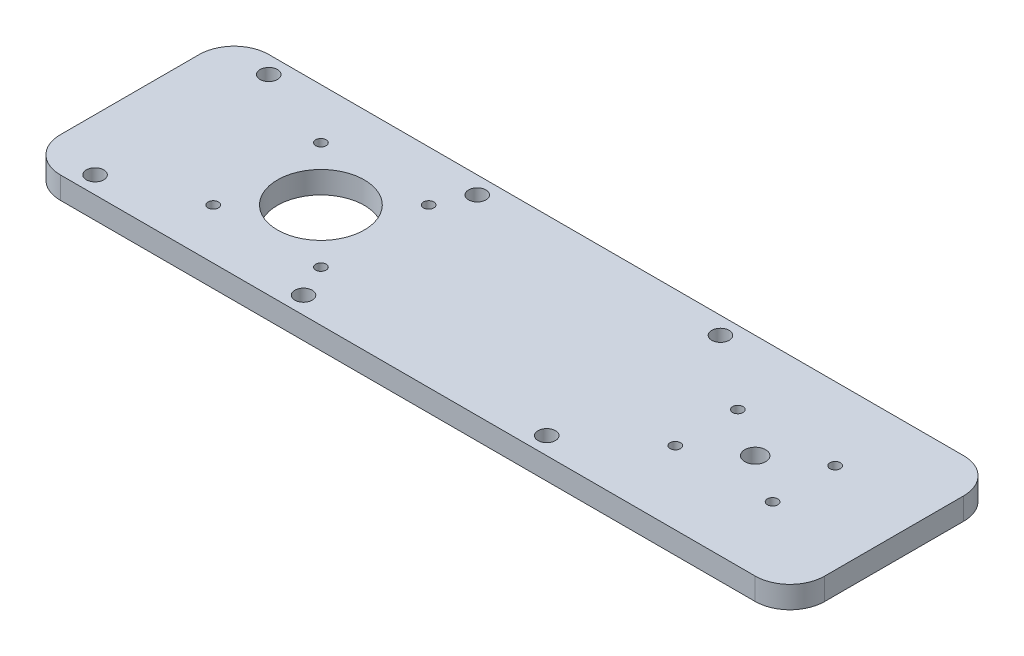
ISO-10303-21;
HEADER;
FILE_DESCRIPTION(('STEP AP214'),'2;1');
FILE_NAME('part.step','',(''),(''),'','','');
FILE_SCHEMA(('AUTOMOTIVE_DESIGN { 1 0 10303 214 1 1 1 1 }'));
ENDSEC;
DATA;
#1=APPLICATION_CONTEXT('core data for automotive mechanical design processes');
#2=APPLICATION_PROTOCOL_DEFINITION('international standard','automotive_design',2000,#1);
#3=PRODUCT_CONTEXT('',#1,'mechanical');
#4=PRODUCT('Part','Part','',(#3));
#5=PRODUCT_RELATED_PRODUCT_CATEGORY('part','',(#4));
#6=PRODUCT_DEFINITION_FORMATION('','',#4);
#7=PRODUCT_DEFINITION_CONTEXT('part definition',#1,'design');
#8=PRODUCT_DEFINITION('design','',#6,#7);
#9=PRODUCT_DEFINITION_SHAPE('','',#8);
#10=(LENGTH_UNIT() NAMED_UNIT(*) SI_UNIT(.MILLI.,.METRE.));
#11=(NAMED_UNIT(*) PLANE_ANGLE_UNIT() SI_UNIT($,.RADIAN.));
#12=(NAMED_UNIT(*) SI_UNIT($,.STERADIAN.) SOLID_ANGLE_UNIT());
#13=UNCERTAINTY_MEASURE_WITH_UNIT(LENGTH_MEASURE(1.E-05),#10,'distance_accuracy_value','');
#14=(GEOMETRIC_REPRESENTATION_CONTEXT(3) GLOBAL_UNCERTAINTY_ASSIGNED_CONTEXT((#13)) GLOBAL_UNIT_ASSIGNED_CONTEXT((#10,
#11,#12)) REPRESENTATION_CONTEXT('',''));
#15=CARTESIAN_POINT('',(0.,0.,0.));
#16=DIRECTION('',(0.,0.,1.));
#17=DIRECTION('',(1.,0.,0.));
#18=AXIS2_PLACEMENT_3D('',#15,#16,#17);
#19=CARTESIAN_POINT('',(0.,0.,0.));
#20=DIRECTION('',(0.,1.,0.));
#21=DIRECTION('',(0.,0.,1.));
#22=AXIS2_PLACEMENT_3D('',#19,#20,#21);
#23=PLANE('',#22);
#24=CARTESIAN_POINT('',(20.,0.,25.));
#25=DIRECTION('',(0.,1.,0.));
#26=DIRECTION('',(0.,0.,1.));
#27=AXIS2_PLACEMENT_3D('',#24,#25,#26);
#28=CIRCLE('',#27,2.5);
#29=CARTESIAN_POINT('',(20.,0.,27.5));
#30=VERTEX_POINT('',#29);
#31=EDGE_CURVE('E330',#30,#30,#28,.T.);
#32=ORIENTED_EDGE('',*,*,#31,.T.);
#33=EDGE_LOOP('',(#32));
#34=FACE_BOUND('',#33,.T.);
#35=CARTESIAN_POINT('',(90.,0.,25.));
#36=DIRECTION('',(0.,1.,0.));
#37=DIRECTION('',(0.,0.,1.));
#38=AXIS2_PLACEMENT_3D('',#35,#36,#37);
#39=CIRCLE('',#38,2.5);
#40=CARTESIAN_POINT('',(90.,0.,27.5));
#41=VERTEX_POINT('',#40);
#42=EDGE_CURVE('E322',#41,#41,#39,.T.);
#43=ORIENTED_EDGE('',*,*,#42,.T.);
#44=EDGE_LOOP('',(#43));
#45=FACE_BOUND('',#44,.T.);
#46=CARTESIAN_POINT('',(90.,0.,-25.));
#47=DIRECTION('',(0.,1.,0.));
#48=DIRECTION('',(0.,0.,1.));
#49=AXIS2_PLACEMENT_3D('',#46,#47,#48);
#50=CIRCLE('',#49,2.5);
#51=CARTESIAN_POINT('',(90.,0.,-22.5));
#52=VERTEX_POINT('',#51);
#53=EDGE_CURVE('E314',#52,#52,#50,.T.);
#54=ORIENTED_EDGE('',*,*,#53,.T.);
#55=EDGE_LOOP('',(#54));
#56=FACE_BOUND('',#55,.T.);
#57=CARTESIAN_POINT('',(20.,0.,-25.));
#58=DIRECTION('',(0.,1.,0.));
#59=DIRECTION('',(0.,0.,1.));
#60=AXIS2_PLACEMENT_3D('',#57,#58,#59);
#61=CIRCLE('',#60,2.5);
#62=CARTESIAN_POINT('',(20.,0.,-22.5));
#63=VERTEX_POINT('',#62);
#64=EDGE_CURVE('E306',#63,#63,#61,.T.);
#65=ORIENTED_EDGE('',*,*,#64,.T.);
#66=EDGE_LOOP('',(#65));
#67=FACE_BOUND('',#66,.T.);
#68=CARTESIAN_POINT('',(-40.,0.,25.));
#69=DIRECTION('',(0.,1.,0.));
#70=DIRECTION('',(0.,0.,1.));
#71=AXIS2_PLACEMENT_3D('',#68,#69,#70);
#72=CIRCLE('',#71,2.5);
#73=CARTESIAN_POINT('',(-40.,0.,27.5));
#74=VERTEX_POINT('',#73);
#75=EDGE_CURVE('E298',#74,#74,#72,.T.);
#76=ORIENTED_EDGE('',*,*,#75,.T.);
#77=EDGE_LOOP('',(#76));
#78=FACE_BOUND('',#77,.T.);
#79=CARTESIAN_POINT('',(-40.,0.,-25.));
#80=DIRECTION('',(0.,1.,0.));
#81=DIRECTION('',(0.,0.,1.));
#82=AXIS2_PLACEMENT_3D('',#79,#80,#81);
#83=CIRCLE('',#82,2.5);
#84=CARTESIAN_POINT('',(-40.,0.,-22.5));
#85=VERTEX_POINT('',#84);
#86=EDGE_CURVE('E290',#85,#85,#83,.T.);
#87=ORIENTED_EDGE('',*,*,#86,.T.);
#88=EDGE_LOOP('',(#87));
#89=FACE_BOUND('',#88,.T.);
#90=CARTESIAN_POINT('',(125.,0.,0.));
#91=DIRECTION('',(0.,1.,0.));
#92=DIRECTION('',(0.,0.,1.));
#93=AXIS2_PLACEMENT_3D('',#90,#91,#92);
#94=CIRCLE('',#93,3.);
#95=CARTESIAN_POINT('',(125.,0.,3.));
#96=VERTEX_POINT('',#95);
#97=EDGE_CURVE('E247',#96,#96,#94,.T.);
#98=ORIENTED_EDGE('',*,*,#97,.T.);
#99=EDGE_LOOP('',(#98));
#100=FACE_BOUND('',#99,.T.);
#101=CARTESIAN_POINT('',(0.,0.,0.));
#102=DIRECTION('',(0.,1.,0.));
#103=DIRECTION('',(0.,0.,1.));
#104=AXIS2_PLACEMENT_3D('',#101,#102,#103);
#105=CIRCLE('',#104,12.5);
#106=CARTESIAN_POINT('',(0.,0.,12.5));
#107=VERTEX_POINT('',#106);
#108=EDGE_CURVE('E242',#107,#107,#105,.T.);
#109=ORIENTED_EDGE('',*,*,#108,.T.);
#110=EDGE_LOOP('',(#109));
#111=FACE_BOUND('',#110,.T.);
#112=CARTESIAN_POINT('',(-15.5,0.,-15.5));
#113=DIRECTION('',(0.,1.,0.));
#114=DIRECTION('',(0.,0.,1.));
#115=AXIS2_PLACEMENT_3D('',#112,#113,#114);
#116=CIRCLE('',#115,1.5);
#117=CARTESIAN_POINT('',(-15.5,0.,-14.));
#118=VERTEX_POINT('',#117);
#119=EDGE_CURVE('E234',#118,#118,#116,.T.);
#120=ORIENTED_EDGE('',*,*,#119,.T.);
#121=EDGE_LOOP('',(#120));
#122=FACE_BOUND('',#121,.T.);
#123=CARTESIAN_POINT('',(15.5,0.,-15.5000000000002));
#124=DIRECTION('',(0.,1.,0.));
#125=DIRECTION('',(0.,0.,1.));
#126=AXIS2_PLACEMENT_3D('',#123,#124,#125);
#127=CIRCLE('',#126,1.5);
#128=CARTESIAN_POINT('',(15.5,0.,-14.0000000000002));
#129=VERTEX_POINT('',#128);
#130=EDGE_CURVE('E226',#129,#129,#127,.T.);
#131=ORIENTED_EDGE('',*,*,#130,.T.);
#132=EDGE_LOOP('',(#131));
#133=FACE_BOUND('',#132,.T.);
#134=CARTESIAN_POINT('',(15.5,0.,15.4999999999998));
#135=DIRECTION('',(0.,1.,0.));
#136=DIRECTION('',(0.,0.,1.));
#137=AXIS2_PLACEMENT_3D('',#134,#135,#136);
#138=CIRCLE('',#137,1.5);
#139=CARTESIAN_POINT('',(15.5,0.,16.9999999999998));
#140=VERTEX_POINT('',#139);
#141=EDGE_CURVE('E218',#140,#140,#138,.T.);
#142=ORIENTED_EDGE('',*,*,#141,.T.);
#143=EDGE_LOOP('',(#142));
#144=FACE_BOUND('',#143,.T.);
#145=CARTESIAN_POINT('',(-15.5,0.,15.5000000000002));
#146=DIRECTION('',(0.,1.,0.));
#147=DIRECTION('',(0.,0.,1.));
#148=AXIS2_PLACEMENT_3D('',#145,#146,#147);
#149=CIRCLE('',#148,1.5);
#150=CARTESIAN_POINT('',(-15.5,0.,17.0000000000002));
#151=VERTEX_POINT('',#150);
#152=EDGE_CURVE('E145',#151,#151,#149,.T.);
#153=ORIENTED_EDGE('',*,*,#152,.T.);
#154=EDGE_LOOP('',(#153));
#155=FACE_BOUND('',#154,.T.);
#156=DIRECTION('',(1.,0.,0.));
#157=VECTOR('',#156,1.);
#158=CARTESIAN_POINT('',(-55.,0.,30.));
#159=LINE('',#158,#157);
#160=CARTESIAN_POINT('',(-45.,0.,30.));
#161=VERTEX_POINT('',#160);
#162=CARTESIAN_POINT('',(155.,0.,30.));
#163=VERTEX_POINT('',#162);
#164=EDGE_CURVE('E125',#161,#163,#159,.T.);
#165=ORIENTED_EDGE('',*,*,#164,.F.);
#166=CARTESIAN_POINT('',(-45.,0.,20.));
#167=DIRECTION('',(0.,1.,0.));
#168=DIRECTION('',(0.,0.,1.));
#169=AXIS2_PLACEMENT_3D('',#166,#167,#168);
#170=CIRCLE('',#169,10.);
#171=CARTESIAN_POINT('',(-55.,0.,20.));
#172=VERTEX_POINT('',#171);
#173=EDGE_CURVE('E107',#161,#172,#170,.F.);
#174=ORIENTED_EDGE('',*,*,#173,.T.);
#175=DIRECTION('',(0.,0.,1.));
#176=VECTOR('',#175,1.);
#177=CARTESIAN_POINT('',(-55.,0.,-30.));
#178=LINE('',#177,#176);
#179=CARTESIAN_POINT('',(-55.,0.,-20.));
#180=VERTEX_POINT('',#179);
#181=EDGE_CURVE('E138',#180,#172,#178,.T.);
#182=ORIENTED_EDGE('',*,*,#181,.F.);
#183=CARTESIAN_POINT('',(-45.,0.,-20.));
#184=DIRECTION('',(0.,1.,0.));
#185=DIRECTION('',(0.,0.,1.));
#186=AXIS2_PLACEMENT_3D('',#183,#184,#185);
#187=CIRCLE('',#186,10.);
#188=CARTESIAN_POINT('',(-45.,0.,-30.));
#189=VERTEX_POINT('',#188);
#190=EDGE_CURVE('E119',#180,#189,#187,.F.);
#191=ORIENTED_EDGE('',*,*,#190,.T.);
#192=DIRECTION('',(-1.,0.,0.));
#193=VECTOR('',#192,1.);
#194=CARTESIAN_POINT('',(-55.,0.,-30.));
#195=LINE('',#194,#193);
#196=CARTESIAN_POINT('',(155.,0.,-30.));
#197=VERTEX_POINT('',#196);
#198=EDGE_CURVE('E143',#197,#189,#195,.T.);
#199=ORIENTED_EDGE('',*,*,#198,.F.);
#200=CARTESIAN_POINT('',(155.,0.,-20.));
#201=DIRECTION('',(0.,1.,0.));
#202=DIRECTION('',(0.,0.,1.));
#203=AXIS2_PLACEMENT_3D('',#200,#201,#202);
#204=CIRCLE('',#203,10.);
#205=CARTESIAN_POINT('',(165.,0.,-20.));
#206=VERTEX_POINT('',#205);
#207=EDGE_CURVE('E130',#197,#206,#204,.F.);
#208=ORIENTED_EDGE('',*,*,#207,.T.);
#209=DIRECTION('',(0.,0.,-1.));
#210=VECTOR('',#209,1.);
#211=CARTESIAN_POINT('',(165.,0.,-30.));
#212=LINE('',#211,#210);
#213=CARTESIAN_POINT('',(165.,0.,20.));
#214=VERTEX_POINT('',#213);
#215=EDGE_CURVE('E137',#214,#206,#212,.T.);
#216=ORIENTED_EDGE('',*,*,#215,.F.);
#217=CARTESIAN_POINT('',(155.,0.,20.));
#218=DIRECTION('',(0.,1.,0.));
#219=DIRECTION('',(0.,0.,1.));
#220=AXIS2_PLACEMENT_3D('',#217,#218,#219);
#221=CIRCLE('',#220,10.);
#222=EDGE_CURVE('E135',#214,#163,#221,.F.);
#223=ORIENTED_EDGE('',*,*,#222,.T.);
#224=EDGE_LOOP('',(#165,#174,#182,#191,#199,#208,#216,#223));
#225=FACE_BOUND('',#224,.T.);
#226=CARTESIAN_POINT('',(139.,0.,9.));
#227=DIRECTION('',(0.,-1.,0.));
#228=DIRECTION('',(0.,0.,-1.));
#229=AXIS2_PLACEMENT_3D('',#226,#227,#228);
#230=CIRCLE('',#229,1.5);
#231=CARTESIAN_POINT('',(139.,0.,7.5));
#232=VERTEX_POINT('',#231);
#233=EDGE_CURVE('E262',#232,#232,#230,.T.);
#234=ORIENTED_EDGE('',*,*,#233,.F.);
#235=EDGE_LOOP('',(#234));
#236=FACE_BOUND('',#235,.T.);
#237=CARTESIAN_POINT('',(111.,0.,9.));
#238=DIRECTION('',(0.,-1.,0.));
#239=DIRECTION('',(0.,0.,-1.));
#240=AXIS2_PLACEMENT_3D('',#237,#238,#239);
#241=CIRCLE('',#240,1.5);
#242=CARTESIAN_POINT('',(111.,0.,7.5));
#243=VERTEX_POINT('',#242);
#244=EDGE_CURVE('E270',#243,#243,#241,.T.);
#245=ORIENTED_EDGE('',*,*,#244,.F.);
#246=EDGE_LOOP('',(#245));
#247=FACE_BOUND('',#246,.T.);
#248=CARTESIAN_POINT('',(111.,0.,-9.));
#249=DIRECTION('',(0.,-1.,0.));
#250=DIRECTION('',(0.,0.,-1.));
#251=AXIS2_PLACEMENT_3D('',#248,#249,#250);
#252=CIRCLE('',#251,1.5);
#253=CARTESIAN_POINT('',(111.,0.,-10.5));
#254=VERTEX_POINT('',#253);
#255=EDGE_CURVE('E278',#254,#254,#252,.T.);
#256=ORIENTED_EDGE('',*,*,#255,.F.);
#257=EDGE_LOOP('',(#256));
#258=FACE_BOUND('',#257,.T.);
#259=CARTESIAN_POINT('',(139.,0.,-9.));
#260=DIRECTION('',(0.,-1.,0.));
#261=DIRECTION('',(0.,0.,-1.));
#262=AXIS2_PLACEMENT_3D('',#259,#260,#261);
#263=CIRCLE('',#262,1.5);
#264=CARTESIAN_POINT('',(139.,0.,-10.5));
#265=VERTEX_POINT('',#264);
#266=EDGE_CURVE('E286',#265,#265,#263,.T.);
#267=ORIENTED_EDGE('',*,*,#266,.F.);
#268=EDGE_LOOP('',(#267));
#269=FACE_BOUND('',#268,.T.);
#270=ADVANCED_FACE('F39',(#34,#45,#56,#67,#78,#89,#100,#111,#122,#133,#144,#155,#225,#236,#247,
#258,#269),#23,.F.);
#271=CARTESIAN_POINT('',(-55.,6.35,-30.));
#272=DIRECTION('',(1.,0.,0.));
#273=DIRECTION('',(0.,0.,-1.));
#274=AXIS2_PLACEMENT_3D('',#271,#272,#273);
#275=PLANE('',#274);
#276=ORIENTED_EDGE('',*,*,#181,.T.);
#277=DIRECTION('',(0.,-1.,0.));
#278=VECTOR('',#277,1.);
#279=CARTESIAN_POINT('',(-55.,6.35,20.));
#280=LINE('',#279,#278);
#281=CARTESIAN_POINT('',(-55.,6.35,20.));
#282=VERTEX_POINT('',#281);
#283=EDGE_CURVE('E112',#172,#282,#280,.F.);
#284=ORIENTED_EDGE('',*,*,#283,.T.);
#285=DIRECTION('',(0.,0.,1.));
#286=VECTOR('',#285,1.);
#287=CARTESIAN_POINT('',(-55.,6.35,-30.));
#288=LINE('',#287,#286);
#289=CARTESIAN_POINT('',(-55.,6.35,-20.));
#290=VERTEX_POINT('',#289);
#291=EDGE_CURVE('E151',#290,#282,#288,.T.);
#292=ORIENTED_EDGE('',*,*,#291,.F.);
#293=DIRECTION('',(0.,-1.,0.));
#294=VECTOR('',#293,1.);
#295=CARTESIAN_POINT('',(-55.,6.35,-20.));
#296=LINE('',#295,#294);
#297=EDGE_CURVE('E118',#290,#180,#296,.T.);
#298=ORIENTED_EDGE('',*,*,#297,.T.);
#299=EDGE_LOOP('',(#276,#284,#292,#298));
#300=FACE_BOUND('',#299,.T.);
#301=ADVANCED_FACE('F204',(#300),#275,.F.);
#302=CARTESIAN_POINT('',(-55.,6.35,30.));
#303=DIRECTION('',(0.,0.,-1.));
#304=DIRECTION('',(-1.,0.,0.));
#305=AXIS2_PLACEMENT_3D('',#302,#303,#304);
#306=PLANE('',#305);
#307=DIRECTION('',(1.,0.,0.));
#308=VECTOR('',#307,1.);
#309=CARTESIAN_POINT('',(-55.,6.35,30.));
#310=LINE('',#309,#308);
#311=CARTESIAN_POINT('',(-45.,6.35,30.));
#312=VERTEX_POINT('',#311);
#313=CARTESIAN_POINT('',(155.,6.35,30.));
#314=VERTEX_POINT('',#313);
#315=EDGE_CURVE('E128',#312,#314,#310,.T.);
#316=ORIENTED_EDGE('',*,*,#315,.F.);
#317=DIRECTION('',(0.,-1.,0.));
#318=VECTOR('',#317,1.);
#319=CARTESIAN_POINT('',(-45.,6.35,30.));
#320=LINE('',#319,#318);
#321=EDGE_CURVE('E111',#312,#161,#320,.T.);
#322=ORIENTED_EDGE('',*,*,#321,.T.);
#323=ORIENTED_EDGE('',*,*,#164,.T.);
#324=DIRECTION('',(0.,-1.,0.));
#325=VECTOR('',#324,1.);
#326=CARTESIAN_POINT('',(155.,6.35,30.));
#327=LINE('',#326,#325);
#328=EDGE_CURVE('E131',#163,#314,#327,.F.);
#329=ORIENTED_EDGE('',*,*,#328,.T.);
#330=EDGE_LOOP('',(#316,#322,#323,#329));
#331=FACE_BOUND('',#330,.T.);
#332=ADVANCED_FACE('F124',(#331),#306,.F.);
#333=CARTESIAN_POINT('',(165.,6.35,-30.));
#334=DIRECTION('',(-1.,0.,0.));
#335=DIRECTION('',(0.,0.,1.));
#336=AXIS2_PLACEMENT_3D('',#333,#334,#335);
#337=PLANE('',#336);
#338=DIRECTION('',(0.,0.,-1.));
#339=VECTOR('',#338,1.);
#340=CARTESIAN_POINT('',(165.,6.35,-30.));
#341=LINE('',#340,#339);
#342=CARTESIAN_POINT('',(165.,6.35,20.));
#343=VERTEX_POINT('',#342);
#344=CARTESIAN_POINT('',(165.,6.35,-20.));
#345=VERTEX_POINT('',#344);
#346=EDGE_CURVE('E187',#343,#345,#341,.T.);
#347=ORIENTED_EDGE('',*,*,#346,.F.);
#348=DIRECTION('',(0.,-1.,0.));
#349=VECTOR('',#348,1.);
#350=CARTESIAN_POINT('',(165.,6.35,20.));
#351=LINE('',#350,#349);
#352=EDGE_CURVE('E11',#343,#214,#351,.T.);
#353=ORIENTED_EDGE('',*,*,#352,.T.);
#354=ORIENTED_EDGE('',*,*,#215,.T.);
#355=DIRECTION('',(0.,-1.,0.));
#356=VECTOR('',#355,1.);
#357=CARTESIAN_POINT('',(165.,6.35,-20.));
#358=LINE('',#357,#356);
#359=EDGE_CURVE('E48',#206,#345,#358,.F.);
#360=ORIENTED_EDGE('',*,*,#359,.T.);
#361=EDGE_LOOP('',(#347,#353,#354,#360));
#362=FACE_BOUND('',#361,.T.);
#363=ADVANCED_FACE('F186',(#362),#337,.F.);
#364=CARTESIAN_POINT('',(-55.,6.35,-30.));
#365=DIRECTION('',(0.,0.,1.));
#366=DIRECTION('',(1.,0.,0.));
#367=AXIS2_PLACEMENT_3D('',#364,#365,#366);
#368=PLANE('',#367);
#369=ORIENTED_EDGE('',*,*,#198,.T.);
#370=DIRECTION('',(0.,-1.,0.));
#371=VECTOR('',#370,1.);
#372=CARTESIAN_POINT('',(-45.,6.35,-30.));
#373=LINE('',#372,#371);
#374=CARTESIAN_POINT('',(-45.,6.35,-30.));
#375=VERTEX_POINT('',#374);
#376=EDGE_CURVE('E55',#189,#375,#373,.F.);
#377=ORIENTED_EDGE('',*,*,#376,.T.);
#378=DIRECTION('',(-1.,0.,0.));
#379=VECTOR('',#378,1.);
#380=CARTESIAN_POINT('',(-55.,6.35,-30.));
#381=LINE('',#380,#379);
#382=CARTESIAN_POINT('',(155.,6.35,-30.));
#383=VERTEX_POINT('',#382);
#384=EDGE_CURVE('E153',#383,#375,#381,.T.);
#385=ORIENTED_EDGE('',*,*,#384,.F.);
#386=DIRECTION('',(0.,-1.,0.));
#387=VECTOR('',#386,1.);
#388=CARTESIAN_POINT('',(155.,6.35,-30.));
#389=LINE('',#388,#387);
#390=EDGE_CURVE('E177',#383,#197,#389,.T.);
#391=ORIENTED_EDGE('',*,*,#390,.T.);
#392=EDGE_LOOP('',(#369,#377,#385,#391));
#393=FACE_BOUND('',#392,.T.);
#394=ADVANCED_FACE('F197',(#393),#368,.F.);
#395=CARTESIAN_POINT('',(0.,6.35,0.));
#396=DIRECTION('',(0.,1.,0.));
#397=DIRECTION('',(0.,0.,1.));
#398=AXIS2_PLACEMENT_3D('',#395,#396,#397);
#399=PLANE('',#398);
#400=CARTESIAN_POINT('',(20.,6.35,25.));
#401=DIRECTION('',(0.,1.,0.));
#402=DIRECTION('',(0.,0.,1.));
#403=AXIS2_PLACEMENT_3D('',#400,#401,#402);
#404=CIRCLE('',#403,2.5);
#405=CARTESIAN_POINT('',(20.,6.35,27.5));
#406=VERTEX_POINT('',#405);
#407=EDGE_CURVE('E334',#406,#406,#404,.T.);
#408=ORIENTED_EDGE('',*,*,#407,.F.);
#409=EDGE_LOOP('',(#408));
#410=FACE_BOUND('',#409,.T.);
#411=CARTESIAN_POINT('',(90.,6.35,25.));
#412=DIRECTION('',(0.,1.,0.));
#413=DIRECTION('',(0.,0.,1.));
#414=AXIS2_PLACEMENT_3D('',#411,#412,#413);
#415=CIRCLE('',#414,2.5);
#416=CARTESIAN_POINT('',(90.,6.35,27.5));
#417=VERTEX_POINT('',#416);
#418=EDGE_CURVE('E326',#417,#417,#415,.T.);
#419=ORIENTED_EDGE('',*,*,#418,.F.);
#420=EDGE_LOOP('',(#419));
#421=FACE_BOUND('',#420,.T.);
#422=CARTESIAN_POINT('',(90.,6.35,-25.));
#423=DIRECTION('',(0.,1.,0.));
#424=DIRECTION('',(0.,0.,1.));
#425=AXIS2_PLACEMENT_3D('',#422,#423,#424);
#426=CIRCLE('',#425,2.5);
#427=CARTESIAN_POINT('',(90.,6.35,-22.5));
#428=VERTEX_POINT('',#427);
#429=EDGE_CURVE('E318',#428,#428,#426,.T.);
#430=ORIENTED_EDGE('',*,*,#429,.F.);
#431=EDGE_LOOP('',(#430));
#432=FACE_BOUND('',#431,.T.);
#433=CARTESIAN_POINT('',(20.,6.35,-25.));
#434=DIRECTION('',(0.,1.,0.));
#435=DIRECTION('',(0.,0.,1.));
#436=AXIS2_PLACEMENT_3D('',#433,#434,#435);
#437=CIRCLE('',#436,2.5);
#438=CARTESIAN_POINT('',(20.,6.35,-22.5));
#439=VERTEX_POINT('',#438);
#440=EDGE_CURVE('E310',#439,#439,#437,.T.);
#441=ORIENTED_EDGE('',*,*,#440,.F.);
#442=EDGE_LOOP('',(#441));
#443=FACE_BOUND('',#442,.T.);
#444=CARTESIAN_POINT('',(-40.,6.35,25.));
#445=DIRECTION('',(0.,1.,0.));
#446=DIRECTION('',(0.,0.,1.));
#447=AXIS2_PLACEMENT_3D('',#444,#445,#446);
#448=CIRCLE('',#447,2.5);
#449=CARTESIAN_POINT('',(-40.,6.35,27.5));
#450=VERTEX_POINT('',#449);
#451=EDGE_CURVE('E302',#450,#450,#448,.T.);
#452=ORIENTED_EDGE('',*,*,#451,.F.);
#453=EDGE_LOOP('',(#452));
#454=FACE_BOUND('',#453,.T.);
#455=CARTESIAN_POINT('',(-40.,6.35,-25.));
#456=DIRECTION('',(0.,1.,0.));
#457=DIRECTION('',(0.,0.,1.));
#458=AXIS2_PLACEMENT_3D('',#455,#456,#457);
#459=CIRCLE('',#458,2.5);
#460=CARTESIAN_POINT('',(-40.,6.35,-22.5));
#461=VERTEX_POINT('',#460);
#462=EDGE_CURVE('E294',#461,#461,#459,.T.);
#463=ORIENTED_EDGE('',*,*,#462,.F.);
#464=EDGE_LOOP('',(#463));
#465=FACE_BOUND('',#464,.T.);
#466=CARTESIAN_POINT('',(139.,6.35,-9.));
#467=DIRECTION('',(0.,1.,0.));
#468=DIRECTION('',(0.,0.,1.));
#469=AXIS2_PLACEMENT_3D('',#466,#467,#468);
#470=CIRCLE('',#469,1.5);
#471=CARTESIAN_POINT('',(139.,6.35,-7.5));
#472=VERTEX_POINT('',#471);
#473=EDGE_CURVE('E282',#472,#472,#470,.T.);
#474=ORIENTED_EDGE('',*,*,#473,.F.);
#475=EDGE_LOOP('',(#474));
#476=FACE_BOUND('',#475,.T.);
#477=CARTESIAN_POINT('',(111.,6.35,-9.));
#478=DIRECTION('',(0.,1.,0.));
#479=DIRECTION('',(0.,0.,1.));
#480=AXIS2_PLACEMENT_3D('',#477,#478,#479);
#481=CIRCLE('',#480,1.5);
#482=CARTESIAN_POINT('',(111.,6.35,-7.5));
#483=VERTEX_POINT('',#482);
#484=EDGE_CURVE('E274',#483,#483,#481,.T.);
#485=ORIENTED_EDGE('',*,*,#484,.F.);
#486=EDGE_LOOP('',(#485));
#487=FACE_BOUND('',#486,.T.);
#488=CARTESIAN_POINT('',(111.,6.35,9.));
#489=DIRECTION('',(0.,1.,0.));
#490=DIRECTION('',(0.,0.,1.));
#491=AXIS2_PLACEMENT_3D('',#488,#489,#490);
#492=CIRCLE('',#491,1.5);
#493=CARTESIAN_POINT('',(111.,6.35,10.5));
#494=VERTEX_POINT('',#493);
#495=EDGE_CURVE('E266',#494,#494,#492,.T.);
#496=ORIENTED_EDGE('',*,*,#495,.F.);
#497=EDGE_LOOP('',(#496));
#498=FACE_BOUND('',#497,.T.);
#499=CARTESIAN_POINT('',(139.,6.35,9.));
#500=DIRECTION('',(0.,1.,0.));
#501=DIRECTION('',(0.,0.,1.));
#502=AXIS2_PLACEMENT_3D('',#499,#500,#501);
#503=CIRCLE('',#502,1.5);
#504=CARTESIAN_POINT('',(139.,6.35,10.5));
#505=VERTEX_POINT('',#504);
#506=EDGE_CURVE('E258',#505,#505,#503,.T.);
#507=ORIENTED_EDGE('',*,*,#506,.F.);
#508=EDGE_LOOP('',(#507));
#509=FACE_BOUND('',#508,.T.);
#510=CARTESIAN_POINT('',(125.,6.35,0.));
#511=DIRECTION('',(0.,1.,0.));
#512=DIRECTION('',(0.,0.,1.));
#513=AXIS2_PLACEMENT_3D('',#510,#511,#512);
#514=CIRCLE('',#513,3.);
#515=CARTESIAN_POINT('',(125.,6.35,3.));
#516=VERTEX_POINT('',#515);
#517=EDGE_CURVE('E254',#516,#516,#514,.T.);
#518=ORIENTED_EDGE('',*,*,#517,.F.);
#519=EDGE_LOOP('',(#518));
#520=FACE_BOUND('',#519,.T.);
#521=CARTESIAN_POINT('',(0.,6.35,0.));
#522=DIRECTION('',(0.,1.,0.));
#523=DIRECTION('',(0.,0.,1.));
#524=AXIS2_PLACEMENT_3D('',#521,#522,#523);
#525=CIRCLE('',#524,12.5);
#526=CARTESIAN_POINT('',(0.,6.35,12.5));
#527=VERTEX_POINT('',#526);
#528=EDGE_CURVE('E243',#527,#527,#525,.T.);
#529=ORIENTED_EDGE('',*,*,#528,.F.);
#530=EDGE_LOOP('',(#529));
#531=FACE_BOUND('',#530,.T.);
#532=CARTESIAN_POINT('',(-15.5,6.35,-15.5));
#533=DIRECTION('',(0.,1.,0.));
#534=DIRECTION('',(0.,0.,1.));
#535=AXIS2_PLACEMENT_3D('',#532,#533,#534);
#536=CIRCLE('',#535,1.5);
#537=CARTESIAN_POINT('',(-15.5,6.35,-14.));
#538=VERTEX_POINT('',#537);
#539=EDGE_CURVE('E238',#538,#538,#536,.T.);
#540=ORIENTED_EDGE('',*,*,#539,.F.);
#541=EDGE_LOOP('',(#540));
#542=FACE_BOUND('',#541,.T.);
#543=CARTESIAN_POINT('',(15.5,6.35,-15.5000000000002));
#544=DIRECTION('',(0.,1.,0.));
#545=DIRECTION('',(0.,0.,1.));
#546=AXIS2_PLACEMENT_3D('',#543,#544,#545);
#547=CIRCLE('',#546,1.5);
#548=CARTESIAN_POINT('',(15.5,6.35,-14.0000000000002));
#549=VERTEX_POINT('',#548);
#550=EDGE_CURVE('E230',#549,#549,#547,.T.);
#551=ORIENTED_EDGE('',*,*,#550,.F.);
#552=EDGE_LOOP('',(#551));
#553=FACE_BOUND('',#552,.T.);
#554=CARTESIAN_POINT('',(15.5,6.35,15.4999999999998));
#555=DIRECTION('',(0.,1.,0.));
#556=DIRECTION('',(0.,0.,1.));
#557=AXIS2_PLACEMENT_3D('',#554,#555,#556);
#558=CIRCLE('',#557,1.5);
#559=CARTESIAN_POINT('',(15.5,6.35,16.9999999999998));
#560=VERTEX_POINT('',#559);
#561=EDGE_CURVE('E222',#560,#560,#558,.T.);
#562=ORIENTED_EDGE('',*,*,#561,.F.);
#563=EDGE_LOOP('',(#562));
#564=FACE_BOUND('',#563,.T.);
#565=CARTESIAN_POINT('',(-15.5,6.35,15.5000000000002));
#566=DIRECTION('',(0.,1.,0.));
#567=DIRECTION('',(0.,0.,1.));
#568=AXIS2_PLACEMENT_3D('',#565,#566,#567);
#569=CIRCLE('',#568,1.5);
#570=CARTESIAN_POINT('',(-15.5,6.35,17.0000000000002));
#571=VERTEX_POINT('',#570);
#572=EDGE_CURVE('E214',#571,#571,#569,.T.);
#573=ORIENTED_EDGE('',*,*,#572,.F.);
#574=EDGE_LOOP('',(#573));
#575=FACE_BOUND('',#574,.T.);
#576=ORIENTED_EDGE('',*,*,#291,.T.);
#577=CARTESIAN_POINT('',(-45.,6.35,20.));
#578=DIRECTION('',(0.,1.,0.));
#579=DIRECTION('',(0.,0.,1.));
#580=AXIS2_PLACEMENT_3D('',#577,#578,#579);
#581=CIRCLE('',#580,10.);
#582=EDGE_CURVE('E174',#282,#312,#581,.T.);
#583=ORIENTED_EDGE('',*,*,#582,.T.);
#584=ORIENTED_EDGE('',*,*,#315,.T.);
#585=CARTESIAN_POINT('',(155.,6.35,20.));
#586=DIRECTION('',(0.,1.,0.));
#587=DIRECTION('',(0.,0.,1.));
#588=AXIS2_PLACEMENT_3D('',#585,#586,#587);
#589=CIRCLE('',#588,10.);
#590=EDGE_CURVE('E168',#314,#343,#589,.T.);
#591=ORIENTED_EDGE('',*,*,#590,.T.);
#592=ORIENTED_EDGE('',*,*,#346,.T.);
#593=CARTESIAN_POINT('',(155.,6.35,-20.));
#594=DIRECTION('',(0.,1.,0.));
#595=DIRECTION('',(0.,0.,1.));
#596=AXIS2_PLACEMENT_3D('',#593,#594,#595);
#597=CIRCLE('',#596,10.);
#598=EDGE_CURVE('E62',#345,#383,#597,.T.);
#599=ORIENTED_EDGE('',*,*,#598,.T.);
#600=ORIENTED_EDGE('',*,*,#384,.T.);
#601=CARTESIAN_POINT('',(-45.,6.35,-20.));
#602=DIRECTION('',(0.,1.,0.));
#603=DIRECTION('',(0.,0.,1.));
#604=AXIS2_PLACEMENT_3D('',#601,#602,#603);
#605=CIRCLE('',#604,10.);
#606=EDGE_CURVE('E171',#375,#290,#605,.T.);
#607=ORIENTED_EDGE('',*,*,#606,.T.);
#608=EDGE_LOOP('',(#576,#583,#584,#591,#592,#599,#600,#607));
#609=FACE_BOUND('',#608,.T.);
#610=ADVANCED_FACE('F191',(#410,#421,#432,#443,#454,#465,#476,#487,#498,#509,#520,#531,#542,
#553,#564,#575,#609),#399,.T.);
#611=CARTESIAN_POINT('',(-45.,6.35,20.));
#612=DIRECTION('',(0.,-1.,0.));
#613=DIRECTION('',(0.,0.,-1.));
#614=AXIS2_PLACEMENT_3D('',#611,#612,#613);
#615=CYLINDRICAL_SURFACE('',#614,10.);
#616=ORIENTED_EDGE('',*,*,#582,.F.);
#617=ORIENTED_EDGE('',*,*,#283,.F.);
#618=ORIENTED_EDGE('',*,*,#173,.F.);
#619=ORIENTED_EDGE('',*,*,#321,.F.);
#620=EDGE_LOOP('',(#616,#617,#618,#619));
#621=FACE_BOUND('',#620,.T.);
#622=ADVANCED_FACE('F110',(#621),#615,.T.);
#623=CARTESIAN_POINT('',(-45.,6.35,-20.));
#624=DIRECTION('',(0.,-1.,0.));
#625=DIRECTION('',(0.,0.,-1.));
#626=AXIS2_PLACEMENT_3D('',#623,#624,#625);
#627=CYLINDRICAL_SURFACE('',#626,10.);
#628=ORIENTED_EDGE('',*,*,#606,.F.);
#629=ORIENTED_EDGE('',*,*,#376,.F.);
#630=ORIENTED_EDGE('',*,*,#190,.F.);
#631=ORIENTED_EDGE('',*,*,#297,.F.);
#632=EDGE_LOOP('',(#628,#629,#630,#631));
#633=FACE_BOUND('',#632,.T.);
#634=ADVANCED_FACE('F201',(#633),#627,.T.);
#635=CARTESIAN_POINT('',(155.,6.35,20.));
#636=DIRECTION('',(0.,-1.,0.));
#637=DIRECTION('',(0.,0.,-1.));
#638=AXIS2_PLACEMENT_3D('',#635,#636,#637);
#639=CYLINDRICAL_SURFACE('',#638,10.);
#640=ORIENTED_EDGE('',*,*,#590,.F.);
#641=ORIENTED_EDGE('',*,*,#328,.F.);
#642=ORIENTED_EDGE('',*,*,#222,.F.);
#643=ORIENTED_EDGE('',*,*,#352,.F.);
#644=EDGE_LOOP('',(#640,#641,#642,#643));
#645=FACE_BOUND('',#644,.T.);
#646=ADVANCED_FACE('F386',(#645),#639,.T.);
#647=CARTESIAN_POINT('',(155.,6.35,-20.));
#648=DIRECTION('',(0.,-1.,0.));
#649=DIRECTION('',(0.,0.,-1.));
#650=AXIS2_PLACEMENT_3D('',#647,#648,#649);
#651=CYLINDRICAL_SURFACE('',#650,10.);
#652=ORIENTED_EDGE('',*,*,#598,.F.);
#653=ORIENTED_EDGE('',*,*,#359,.F.);
#654=ORIENTED_EDGE('',*,*,#207,.F.);
#655=ORIENTED_EDGE('',*,*,#390,.F.);
#656=EDGE_LOOP('',(#652,#653,#654,#655));
#657=FACE_BOUND('',#656,.T.);
#658=ADVANCED_FACE('F41',(#657),#651,.T.);
#659=CARTESIAN_POINT('',(-15.5,6.35,15.5000000000002));
#660=DIRECTION('',(0.,1.,0.));
#661=DIRECTION('',(0.,0.,1.));
#662=AXIS2_PLACEMENT_3D('',#659,#660,#661);
#663=CYLINDRICAL_SURFACE('',#662,1.5);
#664=ORIENTED_EDGE('',*,*,#152,.F.);
#665=EDGE_LOOP('',(#664));
#666=FACE_BOUND('',#665,.T.);
#667=ORIENTED_EDGE('',*,*,#572,.T.);
#668=EDGE_LOOP('',(#667));
#669=FACE_BOUND('',#668,.T.);
#670=ADVANCED_FACE('F374',(#666,#669),#663,.F.);
#671=CARTESIAN_POINT('',(15.5,6.35,15.4999999999998));
#672=DIRECTION('',(0.,1.,0.));
#673=DIRECTION('',(0.,0.,1.));
#674=AXIS2_PLACEMENT_3D('',#671,#672,#673);
#675=CYLINDRICAL_SURFACE('',#674,1.5);
#676=ORIENTED_EDGE('',*,*,#141,.F.);
#677=EDGE_LOOP('',(#676));
#678=FACE_BOUND('',#677,.T.);
#679=ORIENTED_EDGE('',*,*,#561,.T.);
#680=EDGE_LOOP('',(#679));
#681=FACE_BOUND('',#680,.T.);
#682=ADVANCED_FACE('F376',(#678,#681),#675,.F.);
#683=CARTESIAN_POINT('',(15.5,6.35,-15.5000000000002));
#684=DIRECTION('',(0.,1.,0.));
#685=DIRECTION('',(0.,0.,1.));
#686=AXIS2_PLACEMENT_3D('',#683,#684,#685);
#687=CYLINDRICAL_SURFACE('',#686,1.5);
#688=ORIENTED_EDGE('',*,*,#130,.F.);
#689=EDGE_LOOP('',(#688));
#690=FACE_BOUND('',#689,.T.);
#691=ORIENTED_EDGE('',*,*,#550,.T.);
#692=EDGE_LOOP('',(#691));
#693=FACE_BOUND('',#692,.T.);
#694=ADVANCED_FACE('F383',(#690,#693),#687,.F.);
#695=CARTESIAN_POINT('',(-15.5,6.35,-15.5));
#696=DIRECTION('',(0.,1.,0.));
#697=DIRECTION('',(0.,0.,1.));
#698=AXIS2_PLACEMENT_3D('',#695,#696,#697);
#699=CYLINDRICAL_SURFACE('',#698,1.5);
#700=ORIENTED_EDGE('',*,*,#119,.F.);
#701=EDGE_LOOP('',(#700));
#702=FACE_BOUND('',#701,.T.);
#703=ORIENTED_EDGE('',*,*,#539,.T.);
#704=EDGE_LOOP('',(#703));
#705=FACE_BOUND('',#704,.T.);
#706=ADVANCED_FACE('F435',(#702,#705),#699,.F.);
#707=CARTESIAN_POINT('',(0.,0.,0.));
#708=DIRECTION('',(0.,1.,0.));
#709=DIRECTION('',(0.,0.,1.));
#710=AXIS2_PLACEMENT_3D('',#707,#708,#709);
#711=CYLINDRICAL_SURFACE('',#710,12.5);
#712=ORIENTED_EDGE('',*,*,#108,.F.);
#713=EDGE_LOOP('',(#712));
#714=FACE_BOUND('',#713,.T.);
#715=ORIENTED_EDGE('',*,*,#528,.T.);
#716=EDGE_LOOP('',(#715));
#717=FACE_BOUND('',#716,.T.);
#718=ADVANCED_FACE('F445',(#714,#717),#711,.F.);
#719=CARTESIAN_POINT('',(125.,6.35,0.));
#720=DIRECTION('',(0.,1.,0.));
#721=DIRECTION('',(0.,0.,1.));
#722=AXIS2_PLACEMENT_3D('',#719,#720,#721);
#723=CYLINDRICAL_SURFACE('',#722,3.);
#724=ORIENTED_EDGE('',*,*,#97,.F.);
#725=EDGE_LOOP('',(#724));
#726=FACE_BOUND('',#725,.T.);
#727=ORIENTED_EDGE('',*,*,#517,.T.);
#728=EDGE_LOOP('',(#727));
#729=FACE_BOUND('',#728,.T.);
#730=ADVANCED_FACE('F455',(#726,#729),#723,.F.);
#731=CARTESIAN_POINT('',(139.,0.,9.));
#732=DIRECTION('',(0.,-1.,0.));
#733=DIRECTION('',(0.,0.,-1.));
#734=AXIS2_PLACEMENT_3D('',#731,#732,#733);
#735=CYLINDRICAL_SURFACE('',#734,1.5);
#736=ORIENTED_EDGE('',*,*,#233,.T.);
#737=EDGE_LOOP('',(#736));
#738=FACE_BOUND('',#737,.T.);
#739=ORIENTED_EDGE('',*,*,#506,.T.);
#740=EDGE_LOOP('',(#739));
#741=FACE_BOUND('',#740,.T.);
#742=ADVANCED_FACE('F465',(#738,#741),#735,.F.);
#743=CARTESIAN_POINT('',(111.,0.,9.));
#744=DIRECTION('',(0.,-1.,0.));
#745=DIRECTION('',(0.,0.,-1.));
#746=AXIS2_PLACEMENT_3D('',#743,#744,#745);
#747=CYLINDRICAL_SURFACE('',#746,1.5);
#748=ORIENTED_EDGE('',*,*,#244,.T.);
#749=EDGE_LOOP('',(#748));
#750=FACE_BOUND('',#749,.T.);
#751=ORIENTED_EDGE('',*,*,#495,.T.);
#752=EDGE_LOOP('',(#751));
#753=FACE_BOUND('',#752,.T.);
#754=ADVANCED_FACE('F476',(#750,#753),#747,.F.);
#755=CARTESIAN_POINT('',(111.,0.,-9.));
#756=DIRECTION('',(0.,-1.,0.));
#757=DIRECTION('',(0.,0.,-1.));
#758=AXIS2_PLACEMENT_3D('',#755,#756,#757);
#759=CYLINDRICAL_SURFACE('',#758,1.5);
#760=ORIENTED_EDGE('',*,*,#255,.T.);
#761=EDGE_LOOP('',(#760));
#762=FACE_BOUND('',#761,.T.);
#763=ORIENTED_EDGE('',*,*,#484,.T.);
#764=EDGE_LOOP('',(#763));
#765=FACE_BOUND('',#764,.T.);
#766=ADVANCED_FACE('F486',(#762,#765),#759,.F.);
#767=CARTESIAN_POINT('',(139.,0.,-9.));
#768=DIRECTION('',(0.,-1.,0.));
#769=DIRECTION('',(0.,0.,-1.));
#770=AXIS2_PLACEMENT_3D('',#767,#768,#769);
#771=CYLINDRICAL_SURFACE('',#770,1.5);
#772=ORIENTED_EDGE('',*,*,#266,.T.);
#773=EDGE_LOOP('',(#772));
#774=FACE_BOUND('',#773,.T.);
#775=ORIENTED_EDGE('',*,*,#473,.T.);
#776=EDGE_LOOP('',(#775));
#777=FACE_BOUND('',#776,.T.);
#778=ADVANCED_FACE('F496',(#774,#777),#771,.F.);
#779=CARTESIAN_POINT('',(-40.,6.35,-25.));
#780=DIRECTION('',(0.,1.,0.));
#781=DIRECTION('',(0.,0.,1.));
#782=AXIS2_PLACEMENT_3D('',#779,#780,#781);
#783=CYLINDRICAL_SURFACE('',#782,2.5);
#784=ORIENTED_EDGE('',*,*,#86,.F.);
#785=EDGE_LOOP('',(#784));
#786=FACE_BOUND('',#785,.T.);
#787=ORIENTED_EDGE('',*,*,#462,.T.);
#788=EDGE_LOOP('',(#787));
#789=FACE_BOUND('',#788,.T.);
#790=ADVANCED_FACE('F505',(#786,#789),#783,.F.);
#791=CARTESIAN_POINT('',(-40.,6.35,25.));
#792=DIRECTION('',(0.,1.,0.));
#793=DIRECTION('',(0.,0.,1.));
#794=AXIS2_PLACEMENT_3D('',#791,#792,#793);
#795=CYLINDRICAL_SURFACE('',#794,2.5);
#796=ORIENTED_EDGE('',*,*,#75,.F.);
#797=EDGE_LOOP('',(#796));
#798=FACE_BOUND('',#797,.T.);
#799=ORIENTED_EDGE('',*,*,#451,.T.);
#800=EDGE_LOOP('',(#799));
#801=FACE_BOUND('',#800,.T.);
#802=ADVANCED_FACE('F527',(#798,#801),#795,.F.);
#803=CARTESIAN_POINT('',(20.,6.35,-25.));
#804=DIRECTION('',(0.,1.,0.));
#805=DIRECTION('',(0.,0.,1.));
#806=AXIS2_PLACEMENT_3D('',#803,#804,#805);
#807=CYLINDRICAL_SURFACE('',#806,2.5);
#808=ORIENTED_EDGE('',*,*,#64,.F.);
#809=EDGE_LOOP('',(#808));
#810=FACE_BOUND('',#809,.T.);
#811=ORIENTED_EDGE('',*,*,#440,.T.);
#812=EDGE_LOOP('',(#811));
#813=FACE_BOUND('',#812,.T.);
#814=ADVANCED_FACE('F537',(#810,#813),#807,.F.);
#815=CARTESIAN_POINT('',(90.,6.35,-25.));
#816=DIRECTION('',(0.,1.,0.));
#817=DIRECTION('',(0.,0.,1.));
#818=AXIS2_PLACEMENT_3D('',#815,#816,#817);
#819=CYLINDRICAL_SURFACE('',#818,2.5);
#820=ORIENTED_EDGE('',*,*,#53,.F.);
#821=EDGE_LOOP('',(#820));
#822=FACE_BOUND('',#821,.T.);
#823=ORIENTED_EDGE('',*,*,#429,.T.);
#824=EDGE_LOOP('',(#823));
#825=FACE_BOUND('',#824,.T.);
#826=ADVANCED_FACE('F547',(#822,#825),#819,.F.);
#827=CARTESIAN_POINT('',(90.,6.35,25.));
#828=DIRECTION('',(0.,1.,0.));
#829=DIRECTION('',(0.,0.,1.));
#830=AXIS2_PLACEMENT_3D('',#827,#828,#829);
#831=CYLINDRICAL_SURFACE('',#830,2.5);
#832=ORIENTED_EDGE('',*,*,#42,.F.);
#833=EDGE_LOOP('',(#832));
#834=FACE_BOUND('',#833,.T.);
#835=ORIENTED_EDGE('',*,*,#418,.T.);
#836=EDGE_LOOP('',(#835));
#837=FACE_BOUND('',#836,.T.);
#838=ADVANCED_FACE('F557',(#834,#837),#831,.F.);
#839=CARTESIAN_POINT('',(20.,6.35,25.));
#840=DIRECTION('',(0.,1.,0.));
#841=DIRECTION('',(0.,0.,1.));
#842=AXIS2_PLACEMENT_3D('',#839,#840,#841);
#843=CYLINDRICAL_SURFACE('',#842,2.5);
#844=ORIENTED_EDGE('',*,*,#31,.F.);
#845=EDGE_LOOP('',(#844));
#846=FACE_BOUND('',#845,.T.);
#847=ORIENTED_EDGE('',*,*,#407,.T.);
#848=EDGE_LOOP('',(#847));
#849=FACE_BOUND('',#848,.T.);
#850=ADVANCED_FACE('F339',(#846,#849),#843,.F.);
#851=CLOSED_SHELL('',(#270,#301,#332,#363,#394,#610,#622,#634,#646,#658,#670,#682,#694,#706,
#718,#730,#742,#754,#766,#778,#790,#802,#814,#826,#838,#850));
#852=MANIFOLD_SOLID_BREP('B2',#851);
#853=ADVANCED_BREP_SHAPE_REPRESENTATION('',(#18,#852),#14);
#854=SHAPE_DEFINITION_REPRESENTATION(#9,#853);
ENDSEC;
END-ISO-10303-21;
